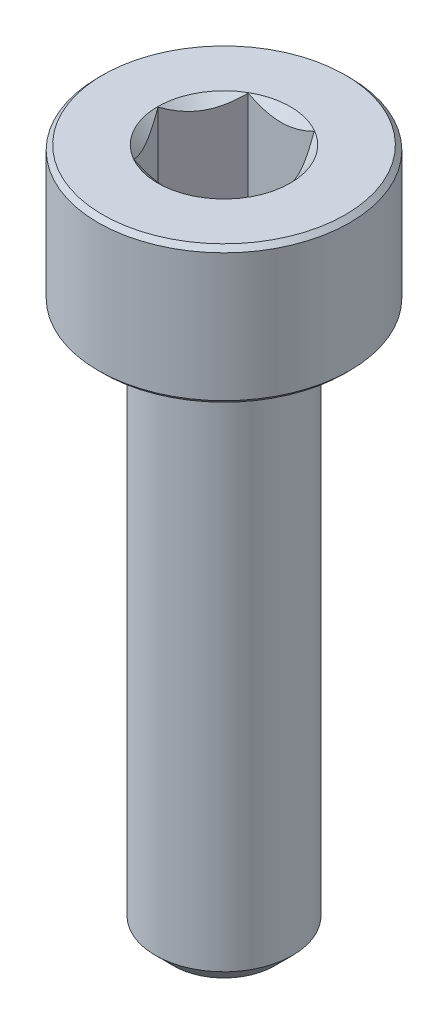
ISO-10303-21;
HEADER;
FILE_DESCRIPTION(('STEP AP214'),'2;1');
FILE_NAME('part.step','',(''),(''),'','','');
FILE_SCHEMA(('AUTOMOTIVE_DESIGN { 1 0 10303 214 1 1 1 1 }'));
ENDSEC;
DATA;
#1=APPLICATION_CONTEXT('core data for automotive mechanical design processes');
#2=APPLICATION_PROTOCOL_DEFINITION('international standard','automotive_design',2000,#1);
#3=PRODUCT_CONTEXT('',#1,'mechanical');
#4=PRODUCT('Part','Part','',(#3));
#5=PRODUCT_RELATED_PRODUCT_CATEGORY('part','',(#4));
#6=PRODUCT_DEFINITION_FORMATION('','',#4);
#7=PRODUCT_DEFINITION_CONTEXT('part definition',#1,'design');
#8=PRODUCT_DEFINITION('design','',#6,#7);
#9=PRODUCT_DEFINITION_SHAPE('','',#8);
#10=(LENGTH_UNIT() NAMED_UNIT(*) SI_UNIT(.MILLI.,.METRE.));
#11=(NAMED_UNIT(*) PLANE_ANGLE_UNIT() SI_UNIT($,.RADIAN.));
#12=(NAMED_UNIT(*) SI_UNIT($,.STERADIAN.) SOLID_ANGLE_UNIT());
#13=UNCERTAINTY_MEASURE_WITH_UNIT(LENGTH_MEASURE(1.E-05),#10,'distance_accuracy_value','');
#14=(GEOMETRIC_REPRESENTATION_CONTEXT(3) GLOBAL_UNCERTAINTY_ASSIGNED_CONTEXT((#13)) GLOBAL_UNIT_ASSIGNED_CONTEXT((#10,
#11,#12)) REPRESENTATION_CONTEXT('',''));
#15=CARTESIAN_POINT('',(0.,0.,0.));
#16=DIRECTION('',(0.,0.,1.));
#17=DIRECTION('',(1.,0.,0.));
#18=AXIS2_PLACEMENT_3D('',#15,#16,#17);
#19=CARTESIAN_POINT('',(146.,110.949080372125,-93.5));
#20=DIRECTION('',(0.,1.,0.));
#21=DIRECTION('',(1.,0.,0.));
#22=AXIS2_PLACEMENT_3D('',#19,#20,#21);
#23=CONICAL_SURFACE('',#22,2.74747334692552,1.22173);
#24=CARTESIAN_POINT('',(146.721687836486,110.474426932663,-92.2499999999985));
#25=CARTESIAN_POINT('',(147.082531754731,110.343090292528,-92.8749999999992));
#26=CARTESIAN_POINT('',(147.443375672974,110.474426932662,-93.4999999999994));
#27=(BOUNDED_CURVE() B_SPLINE_CURVE(2,(#24,#25,#26),.UNSPECIFIED.,.F.,
.F.) B_SPLINE_CURVE_WITH_KNOTS((3,3),(0.,1.),
.UNSPECIFIED.) CURVE() GEOMETRIC_REPRESENTATION_ITEM() RATIONAL_B_SPLINE_CURVE((1.,
1.15470053837961,1.)) REPRESENTATION_ITEM(''));
#28=CARTESIAN_POINT('',(146.721687836487,110.474426932662,-92.25));
#29=VERTEX_POINT('',#28);
#30=CARTESIAN_POINT('',(147.443375672974,110.474426932662,-93.5));
#31=VERTEX_POINT('',#30);
#32=EDGE_CURVE('E10',#29,#31,#27,.T.);
#33=ORIENTED_EDGE('',*,*,#32,.T.);
#34=CARTESIAN_POINT('',(147.443375672975,110.474426932662,-93.4999999999993));
#35=CARTESIAN_POINT('',(147.082531754731,110.343090292528,-94.1249999999996));
#36=CARTESIAN_POINT('',(146.721687836487,110.474426932662,-94.7499999999997));
#37=(BOUNDED_CURVE() B_SPLINE_CURVE(2,(#34,#35,#36),.UNSPECIFIED.,.F.,
.F.) B_SPLINE_CURVE_WITH_KNOTS((3,3),(0.,1.),
.UNSPECIFIED.) CURVE() GEOMETRIC_REPRESENTATION_ITEM() RATIONAL_B_SPLINE_CURVE((1.,
1.15470053837948,1.)) REPRESENTATION_ITEM(''));
#38=CARTESIAN_POINT('',(146.721687836487,110.474426932662,-94.75));
#39=VERTEX_POINT('',#38);
#40=EDGE_CURVE('E96',#31,#39,#37,.T.);
#41=ORIENTED_EDGE('',*,*,#40,.T.);
#42=CARTESIAN_POINT('',(146.721687836488,110.474426932662,-94.75));
#43=CARTESIAN_POINT('',(146.000000000001,110.343090292528,-94.75));
#44=CARTESIAN_POINT('',(145.278312163513,110.474426932662,-94.75));
#45=(BOUNDED_CURVE() B_SPLINE_CURVE(2,(#42,#43,#44),.UNSPECIFIED.,.F.,
.F.) B_SPLINE_CURVE_WITH_KNOTS((3,3),(0.,1.),
.UNSPECIFIED.) CURVE() GEOMETRIC_REPRESENTATION_ITEM() RATIONAL_B_SPLINE_CURVE((1.,
1.15470053837939,1.)) REPRESENTATION_ITEM(''));
#46=CARTESIAN_POINT('',(145.278312163513,110.474426932662,-94.75));
#47=VERTEX_POINT('',#46);
#48=EDGE_CURVE('E169',#39,#47,#45,.T.);
#49=ORIENTED_EDGE('',*,*,#48,.T.);
#50=CARTESIAN_POINT('',(145.278312163514,110.474426932663,-94.7500000000015));
#51=CARTESIAN_POINT('',(144.917468245269,110.343090292528,-94.1250000000008));
#52=CARTESIAN_POINT('',(144.556624327026,110.474426932662,-93.5000000000006));
#53=(BOUNDED_CURVE() B_SPLINE_CURVE(2,(#50,#51,#52),.UNSPECIFIED.,.F.,
.F.) B_SPLINE_CURVE_WITH_KNOTS((3,3),(0.,1.),
.UNSPECIFIED.) CURVE() GEOMETRIC_REPRESENTATION_ITEM() RATIONAL_B_SPLINE_CURVE((1.,
1.15470053837961,1.)) REPRESENTATION_ITEM(''));
#54=CARTESIAN_POINT('',(144.556624327026,110.474426932662,-93.5));
#55=VERTEX_POINT('',#54);
#56=EDGE_CURVE('E139',#47,#55,#53,.T.);
#57=ORIENTED_EDGE('',*,*,#56,.T.);
#58=CARTESIAN_POINT('',(144.556624327025,110.474426932662,-93.5000000000007));
#59=CARTESIAN_POINT('',(144.917468245269,110.343090292528,-92.8750000000004));
#60=CARTESIAN_POINT('',(145.278312163513,110.474426932662,-92.2500000000003));
#61=(BOUNDED_CURVE() B_SPLINE_CURVE(2,(#58,#59,#60),.UNSPECIFIED.,.F.,
.F.) B_SPLINE_CURVE_WITH_KNOTS((3,3),(0.,1.),
.UNSPECIFIED.) CURVE() GEOMETRIC_REPRESENTATION_ITEM() RATIONAL_B_SPLINE_CURVE((1.,
1.15470053837948,1.)) REPRESENTATION_ITEM(''));
#62=CARTESIAN_POINT('',(145.278312163513,110.474426932662,-92.25));
#63=VERTEX_POINT('',#62);
#64=EDGE_CURVE('E217',#55,#63,#61,.T.);
#65=ORIENTED_EDGE('',*,*,#64,.T.);
#66=CARTESIAN_POINT('',(145.278312163512,110.474426932662,-92.25));
#67=CARTESIAN_POINT('',(145.999999999999,110.343090292528,-92.25));
#68=CARTESIAN_POINT('',(146.721687836487,110.474426932662,-92.25));
#69=(BOUNDED_CURVE() B_SPLINE_CURVE(2,(#66,#67,#68),.UNSPECIFIED.,.F.,
.F.) B_SPLINE_CURVE_WITH_KNOTS((3,3),(0.,1.),
.UNSPECIFIED.) CURVE() GEOMETRIC_REPRESENTATION_ITEM() RATIONAL_B_SPLINE_CURVE((1.,
1.15470053837939,1.)) REPRESENTATION_ITEM(''));
#70=EDGE_CURVE('E27',#63,#29,#69,.T.);
#71=ORIENTED_EDGE('',*,*,#70,.T.);
#72=EDGE_LOOP('',(#33,#41,#49,#57,#65,#71));
#73=FACE_BOUND('',#72,.T.);
#74=CARTESIAN_POINT('',(146.,109.949080372125,-93.5));
#75=VERTEX_POINT('',#74);
#76=VERTEX_LOOP('',#75);
#77=FACE_BOUND('',#76,.T.);
#78=ADVANCED_FACE('F16',(#73,#77),#23,.F.);
#79=CARTESIAN_POINT('',(147.443375672974,119.65,-93.5));
#80=DIRECTION('',(-0.866025403784329,0.,-0.50000000000019));
#81=DIRECTION('',(0.,1.,0.));
#82=AXIS2_PLACEMENT_3D('',#79,#80,#81);
#83=PLANE('',#82);
#84=CARTESIAN_POINT('',(146.721687836488,112.643375666478,-92.2500000000014));
#85=CARTESIAN_POINT('',(147.082531754731,112.282531394471,-92.8750000000006));
#86=CARTESIAN_POINT('',(147.443375672975,112.643375666479,-93.5000000000003));
#87=(BOUNDED_CURVE() B_SPLINE_CURVE(2,(#84,#85,#86),.UNSPECIFIED.,.F.,
.F.) B_SPLINE_CURVE_WITH_KNOTS((3,3),(0.,1.),
.UNSPECIFIED.) CURVE() GEOMETRIC_REPRESENTATION_ITEM() RATIONAL_B_SPLINE_CURVE((1.,
1.15470053837916,1.)) REPRESENTATION_ITEM(''));
#88=CARTESIAN_POINT('',(146.721687836487,112.64337566648,-92.25));
#89=VERTEX_POINT('',#88);
#90=CARTESIAN_POINT('',(147.443375672974,112.64337566648,-93.5));
#91=VERTEX_POINT('',#90);
#92=EDGE_CURVE('E101',#89,#91,#87,.T.);
#93=ORIENTED_EDGE('',*,*,#92,.T.);
#94=DIRECTION('',(0.,-1.,0.));
#95=VECTOR('',#94,1.);
#96=CARTESIAN_POINT('',(147.443375672974,119.65,-93.5));
#97=LINE('',#96,#95);
#98=EDGE_CURVE('E89',#91,#31,#97,.T.);
#99=ORIENTED_EDGE('',*,*,#98,.T.);
#100=ORIENTED_EDGE('',*,*,#32,.F.);
#101=DIRECTION('',(0.,-1.,0.));
#102=VECTOR('',#101,1.);
#103=CARTESIAN_POINT('',(146.721687836487,119.65,-92.25));
#104=LINE('',#103,#102);
#105=EDGE_CURVE('E104',#89,#29,#104,.T.);
#106=ORIENTED_EDGE('',*,*,#105,.F.);
#107=EDGE_LOOP('',(#93,#99,#100,#106));
#108=FACE_BOUND('',#107,.T.);
#109=ADVANCED_FACE('F102',(#108),#83,.T.);
#110=CARTESIAN_POINT('',(146.721687836487,119.65,-92.25));
#111=DIRECTION('',(0.,0.,-1.));
#112=DIRECTION('',(0.,-1.,0.));
#113=AXIS2_PLACEMENT_3D('',#110,#111,#112);
#114=PLANE('',#113);
#115=CARTESIAN_POINT('',(145.278312163513,112.64337566648,-92.25));
#116=CARTESIAN_POINT('',(146.,112.282531394472,-92.25));
#117=CARTESIAN_POINT('',(146.721687836487,112.64337566648,-92.25));
#118=(BOUNDED_CURVE() B_SPLINE_CURVE(2,(#115,#116,#117),.UNSPECIFIED.,.F.,
.F.) B_SPLINE_CURVE_WITH_KNOTS((3,3),(0.,1.),
.UNSPECIFIED.) CURVE() GEOMETRIC_REPRESENTATION_ITEM() RATIONAL_B_SPLINE_CURVE((1.,
1.15470053837924,1.)) REPRESENTATION_ITEM(''));
#119=CARTESIAN_POINT('',(145.278312163513,112.64337566648,-92.25));
#120=VERTEX_POINT('',#119);
#121=EDGE_CURVE('E109',#120,#89,#118,.T.);
#122=ORIENTED_EDGE('',*,*,#121,.T.);
#123=ORIENTED_EDGE('',*,*,#105,.T.);
#124=ORIENTED_EDGE('',*,*,#70,.F.);
#125=DIRECTION('',(0.,-1.,0.));
#126=VECTOR('',#125,1.);
#127=CARTESIAN_POINT('',(145.278312163513,119.65,-92.25));
#128=LINE('',#127,#126);
#129=EDGE_CURVE('E145',#120,#63,#128,.T.);
#130=ORIENTED_EDGE('',*,*,#129,.F.);
#131=EDGE_LOOP('',(#122,#123,#124,#130));
#132=FACE_BOUND('',#131,.T.);
#133=ADVANCED_FACE('F277',(#132),#114,.T.);
#134=CARTESIAN_POINT('',(145.278312163513,119.65,-92.25));
#135=DIRECTION('',(0.866025403784329,0.,-0.50000000000019));
#136=DIRECTION('',(0.,-1.,0.));
#137=AXIS2_PLACEMENT_3D('',#134,#135,#136);
#138=PLANE('',#137);
#139=CARTESIAN_POINT('',(144.556624327027,112.643375666478,-93.4999999999977));
#140=CARTESIAN_POINT('',(144.91746824527,112.282531394471,-92.8749999999989));
#141=CARTESIAN_POINT('',(145.278312163513,112.643375666479,-92.2499999999994));
#142=(BOUNDED_CURVE() B_SPLINE_CURVE(2,(#139,#140,#141),.UNSPECIFIED.,.F.,
.F.) B_SPLINE_CURVE_WITH_KNOTS((3,3),(0.,1.),
.UNSPECIFIED.) CURVE() GEOMETRIC_REPRESENTATION_ITEM() RATIONAL_B_SPLINE_CURVE((1.,
1.15470053837903,1.)) REPRESENTATION_ITEM(''));
#143=CARTESIAN_POINT('',(144.556624327026,112.64337566648,-93.5));
#144=VERTEX_POINT('',#143);
#145=EDGE_CURVE('E162',#144,#120,#142,.T.);
#146=ORIENTED_EDGE('',*,*,#145,.T.);
#147=ORIENTED_EDGE('',*,*,#129,.T.);
#148=ORIENTED_EDGE('',*,*,#64,.F.);
#149=DIRECTION('',(0.,-1.,0.));
#150=VECTOR('',#149,1.);
#151=CARTESIAN_POINT('',(144.556624327026,119.65,-93.5));
#152=LINE('',#151,#150);
#153=EDGE_CURVE('E146',#144,#55,#152,.T.);
#154=ORIENTED_EDGE('',*,*,#153,.F.);
#155=EDGE_LOOP('',(#146,#147,#148,#154));
#156=FACE_BOUND('',#155,.T.);
#157=ADVANCED_FACE('F301',(#156),#138,.T.);
#158=CARTESIAN_POINT('',(144.556624327026,119.65,-93.5));
#159=DIRECTION('',(0.866025403784329,0.,0.50000000000019));
#160=DIRECTION('',(0.,-1.,0.));
#161=AXIS2_PLACEMENT_3D('',#158,#159,#160);
#162=PLANE('',#161);
#163=CARTESIAN_POINT('',(145.278312163512,112.643375666478,-94.7499999999986));
#164=CARTESIAN_POINT('',(144.917468245269,112.282531394471,-94.1249999999993));
#165=CARTESIAN_POINT('',(144.556624327025,112.643375666479,-93.4999999999997));
#166=(BOUNDED_CURVE() B_SPLINE_CURVE(2,(#163,#164,#165),.UNSPECIFIED.,.F.,
.F.) B_SPLINE_CURVE_WITH_KNOTS((3,3),(0.,1.),
.UNSPECIFIED.) CURVE() GEOMETRIC_REPRESENTATION_ITEM() RATIONAL_B_SPLINE_CURVE((1.,
1.15470053837916,1.)) REPRESENTATION_ITEM(''));
#167=CARTESIAN_POINT('',(145.278312163513,112.64337566648,-94.75));
#168=VERTEX_POINT('',#167);
#169=EDGE_CURVE('E175',#168,#144,#166,.T.);
#170=ORIENTED_EDGE('',*,*,#169,.T.);
#171=ORIENTED_EDGE('',*,*,#153,.T.);
#172=ORIENTED_EDGE('',*,*,#56,.F.);
#173=DIRECTION('',(0.,-1.,0.));
#174=VECTOR('',#173,1.);
#175=CARTESIAN_POINT('',(145.278312163513,119.65,-94.75));
#176=LINE('',#175,#174);
#177=EDGE_CURVE('E98',#168,#47,#176,.T.);
#178=ORIENTED_EDGE('',*,*,#177,.F.);
#179=EDGE_LOOP('',(#170,#171,#172,#178));
#180=FACE_BOUND('',#179,.T.);
#181=ADVANCED_FACE('F18',(#180),#162,.T.);
#182=CARTESIAN_POINT('',(145.278312163513,119.65,-94.75));
#183=DIRECTION('',(0.,0.,1.));
#184=DIRECTION('',(-1.,0.,0.));
#185=AXIS2_PLACEMENT_3D('',#182,#183,#184);
#186=PLANE('',#185);
#187=CARTESIAN_POINT('',(146.721687836487,112.64337566648,-94.75));
#188=CARTESIAN_POINT('',(146.,112.282531394472,-94.75));
#189=CARTESIAN_POINT('',(145.278312163513,112.64337566648,-94.75));
#190=(BOUNDED_CURVE() B_SPLINE_CURVE(2,(#187,#188,#189),.UNSPECIFIED.,.F.,
.F.) B_SPLINE_CURVE_WITH_KNOTS((3,3),(0.,1.),
.UNSPECIFIED.) CURVE() GEOMETRIC_REPRESENTATION_ITEM() RATIONAL_B_SPLINE_CURVE((1.,
1.15470053837924,1.)) REPRESENTATION_ITEM(''));
#191=CARTESIAN_POINT('',(146.721687836487,112.64337566648,-94.75));
#192=VERTEX_POINT('',#191);
#193=EDGE_CURVE('E115',#192,#168,#190,.T.);
#194=ORIENTED_EDGE('',*,*,#193,.T.);
#195=ORIENTED_EDGE('',*,*,#177,.T.);
#196=ORIENTED_EDGE('',*,*,#48,.F.);
#197=DIRECTION('',(0.,-1.,0.));
#198=VECTOR('',#197,1.);
#199=CARTESIAN_POINT('',(146.721687836487,119.65,-94.75));
#200=LINE('',#199,#198);
#201=EDGE_CURVE('E191',#192,#39,#200,.T.);
#202=ORIENTED_EDGE('',*,*,#201,.F.);
#203=EDGE_LOOP('',(#194,#195,#196,#202));
#204=FACE_BOUND('',#203,.T.);
#205=ADVANCED_FACE('F290',(#204),#186,.T.);
#206=CARTESIAN_POINT('',(146.721687836487,119.65,-94.75));
#207=DIRECTION('',(-0.866025403784329,0.,0.50000000000019));
#208=DIRECTION('',(-0.50000000000019,0.,-0.866025403784329));
#209=AXIS2_PLACEMENT_3D('',#206,#207,#208);
#210=PLANE('',#209);
#211=CARTESIAN_POINT('',(147.443375672973,112.643375666478,-93.5000000000023));
#212=CARTESIAN_POINT('',(147.08253175473,112.282531394471,-94.1250000000011));
#213=CARTESIAN_POINT('',(146.721687836487,112.643375666479,-94.7500000000006));
#214=(BOUNDED_CURVE() B_SPLINE_CURVE(2,(#211,#212,#213),.UNSPECIFIED.,.F.,
.F.) B_SPLINE_CURVE_WITH_KNOTS((3,3),(0.,1.),
.UNSPECIFIED.) CURVE() GEOMETRIC_REPRESENTATION_ITEM() RATIONAL_B_SPLINE_CURVE((1.,
1.15470053837903,1.)) REPRESENTATION_ITEM(''));
#215=EDGE_CURVE('E94',#91,#192,#214,.T.);
#216=ORIENTED_EDGE('',*,*,#215,.T.);
#217=ORIENTED_EDGE('',*,*,#201,.T.);
#218=ORIENTED_EDGE('',*,*,#40,.F.);
#219=ORIENTED_EDGE('',*,*,#98,.F.);
#220=EDGE_LOOP('',(#216,#217,#218,#219));
#221=FACE_BOUND('',#220,.T.);
#222=ADVANCED_FACE('F91',(#221),#210,.T.);
#223=CARTESIAN_POINT('',(146.,112.199998578447,-93.5));
#224=DIRECTION('',(0.,1.,0.));
#225=DIRECTION('',(1.,0.,0.));
#226=AXIS2_PLACEMENT_3D('',#223,#224,#225);
#227=CONICAL_SURFACE('',#226,0.999999019619584,0.785397673207);
#228=CARTESIAN_POINT('',(146.,112.65,-93.5));
#229=DIRECTION('',(0.,-1.,0.));
#230=DIRECTION('',(1.,0.,0.));
#231=AXIS2_PLACEMENT_3D('',#228,#229,#230);
#232=CIRCLE('',#231,1.45);
#233=CARTESIAN_POINT('',(147.45,112.65,-93.5));
#234=VERTEX_POINT('',#233);
#235=EDGE_CURVE('E117',#234,#234,#232,.T.);
#236=ORIENTED_EDGE('',*,*,#235,.F.);
#237=EDGE_LOOP('',(#236));
#238=FACE_BOUND('',#237,.T.);
#239=ORIENTED_EDGE('',*,*,#215,.F.);
#240=ORIENTED_EDGE('',*,*,#92,.F.);
#241=ORIENTED_EDGE('',*,*,#121,.F.);
#242=ORIENTED_EDGE('',*,*,#145,.F.);
#243=ORIENTED_EDGE('',*,*,#169,.F.);
#244=ORIENTED_EDGE('',*,*,#193,.F.);
#245=EDGE_LOOP('',(#239,#240,#241,#242,#243,#244));
#246=FACE_BOUND('',#245,.T.);
#247=ADVANCED_FACE('F112',(#238,#246),#227,.F.);
#248=CARTESIAN_POINT('',(146.,112.65,-93.5));
#249=DIRECTION('',(0.,-1.,0.));
#250=DIRECTION('',(0.,0.,1.));
#251=AXIS2_PLACEMENT_3D('',#248,#249,#250);
#252=PLANE('',#251);
#253=ORIENTED_EDGE('',*,*,#235,.T.);
#254=EDGE_LOOP('',(#253));
#255=FACE_BOUND('',#254,.T.);
#256=CARTESIAN_POINT('',(146.,112.65,-93.5));
#257=DIRECTION('',(0.,-1.,0.));
#258=DIRECTION('',(1.,0.,0.));
#259=AXIS2_PLACEMENT_3D('',#256,#257,#258);
#260=CIRCLE('',#259,2.65);
#261=CARTESIAN_POINT('',(148.65,112.65,-93.5));
#262=VERTEX_POINT('',#261);
#263=EDGE_CURVE('E124',#262,#262,#260,.T.);
#264=ORIENTED_EDGE('',*,*,#263,.F.);
#265=EDGE_LOOP('',(#264));
#266=FACE_BOUND('',#265,.T.);
#267=ADVANCED_FACE('F284',(#255,#266),#252,.F.);
#268=CARTESIAN_POINT('',(146.,97.65,-93.5));
#269=DIRECTION('',(0.,-1.,0.));
#270=DIRECTION('',(0.,0.,1.));
#271=AXIS2_PLACEMENT_3D('',#268,#269,#270);
#272=PLANE('',#271);
#273=CARTESIAN_POINT('',(146.,97.65,-93.5));
#274=DIRECTION('',(0.,-1.,0.));
#275=DIRECTION('',(1.,0.,0.));
#276=AXIS2_PLACEMENT_3D('',#273,#274,#275);
#277=CIRCLE('',#276,1.1);
#278=CARTESIAN_POINT('',(147.1,97.65,-93.5));
#279=VERTEX_POINT('',#278);
#280=EDGE_CURVE('E137',#279,#279,#277,.T.);
#281=ORIENTED_EDGE('',*,*,#280,.T.);
#282=EDGE_LOOP('',(#281));
#283=FACE_BOUND('',#282,.T.);
#284=ADVANCED_FACE('F280',(#283),#272,.T.);
#285=CARTESIAN_POINT('',(146.,112.55,-93.5));
#286=DIRECTION('',(0.,-1.,0.));
#287=DIRECTION('',(1.,0.,0.));
#288=AXIS2_PLACEMENT_3D('',#285,#286,#287);
#289=CONICAL_SURFACE('',#288,2.75,0.785398163397);
#290=ORIENTED_EDGE('',*,*,#263,.T.);
#291=EDGE_LOOP('',(#290));
#292=FACE_BOUND('',#291,.T.);
#293=CARTESIAN_POINT('',(146.,112.55,-93.5));
#294=DIRECTION('',(0.,-1.,0.));
#295=DIRECTION('',(1.,0.,0.));
#296=AXIS2_PLACEMENT_3D('',#293,#294,#295);
#297=CIRCLE('',#296,2.75);
#298=CARTESIAN_POINT('',(148.75,112.55,-93.5));
#299=VERTEX_POINT('',#298);
#300=EDGE_CURVE('E132',#299,#299,#297,.T.);
#301=ORIENTED_EDGE('',*,*,#300,.F.);
#302=EDGE_LOOP('',(#301));
#303=FACE_BOUND('',#302,.T.);
#304=ADVANCED_FACE('F283',(#292,#303),#289,.T.);
#305=CARTESIAN_POINT('',(146.,98.05,-93.5));
#306=DIRECTION('',(0.,1.,0.));
#307=DIRECTION('',(1.,0.,0.));
#308=AXIS2_PLACEMENT_3D('',#305,#306,#307);
#309=CONICAL_SURFACE('',#308,1.5,0.785398163397);
#310=ORIENTED_EDGE('',*,*,#280,.F.);
#311=EDGE_LOOP('',(#310));
#312=FACE_BOUND('',#311,.T.);
#313=CARTESIAN_POINT('',(146.,98.05,-93.5));
#314=DIRECTION('',(0.,-1.,0.));
#315=DIRECTION('',(1.,0.,0.));
#316=AXIS2_PLACEMENT_3D('',#313,#314,#315);
#317=CIRCLE('',#316,1.5);
#318=CARTESIAN_POINT('',(147.5,98.05,-93.5));
#319=VERTEX_POINT('',#318);
#320=EDGE_CURVE('E130',#319,#319,#317,.T.);
#321=ORIENTED_EDGE('',*,*,#320,.T.);
#322=EDGE_LOOP('',(#321));
#323=FACE_BOUND('',#322,.T.);
#324=ADVANCED_FACE('F288',(#312,#323),#309,.T.);
#325=CARTESIAN_POINT('',(146.,112.65,-93.5));
#326=DIRECTION('',(0.,-1.,0.));
#327=DIRECTION('',(1.,0.,0.));
#328=AXIS2_PLACEMENT_3D('',#325,#326,#327);
#329=CYLINDRICAL_SURFACE('',#328,2.75);
#330=CARTESIAN_POINT('',(146.,109.75,-93.5));
#331=DIRECTION('',(0.,-1.,0.));
#332=DIRECTION('',(1.,0.,0.));
#333=AXIS2_PLACEMENT_3D('',#330,#331,#332);
#334=CIRCLE('',#333,2.75);
#335=CARTESIAN_POINT('',(148.75,109.75,-93.5));
#336=VERTEX_POINT('',#335);
#337=EDGE_CURVE('E245',#336,#336,#334,.T.);
#338=ORIENTED_EDGE('',*,*,#337,.F.);
#339=EDGE_LOOP('',(#338));
#340=FACE_BOUND('',#339,.T.);
#341=ORIENTED_EDGE('',*,*,#300,.T.);
#342=EDGE_LOOP('',(#341));
#343=FACE_BOUND('',#342,.T.);
#344=ADVANCED_FACE('F269',(#340,#343),#329,.T.);
#345=CARTESIAN_POINT('',(146.,109.65,-93.5));
#346=DIRECTION('',(0.,-1.,0.));
#347=DIRECTION('',(1.,0.,0.));
#348=AXIS2_PLACEMENT_3D('',#345,#346,#347);
#349=CYLINDRICAL_SURFACE('',#348,1.5);
#350=ORIENTED_EDGE('',*,*,#320,.F.);
#351=EDGE_LOOP('',(#350));
#352=FACE_BOUND('',#351,.T.);
#353=CARTESIAN_POINT('',(146.,109.65,-93.5));
#354=DIRECTION('',(0.,-1.,0.));
#355=DIRECTION('',(1.,0.,0.));
#356=AXIS2_PLACEMENT_3D('',#353,#354,#355);
#357=CIRCLE('',#356,1.5);
#358=CARTESIAN_POINT('',(147.5,109.65,-93.5));
#359=VERTEX_POINT('',#358);
#360=EDGE_CURVE('E238',#359,#359,#357,.T.);
#361=ORIENTED_EDGE('',*,*,#360,.T.);
#362=EDGE_LOOP('',(#361));
#363=FACE_BOUND('',#362,.T.);
#364=ADVANCED_FACE('F259',(#352,#363),#349,.T.);
#365=CARTESIAN_POINT('',(146.,109.75,-93.5));
#366=DIRECTION('',(0.,1.,0.));
#367=DIRECTION('',(1.,0.,0.));
#368=AXIS2_PLACEMENT_3D('',#365,#366,#367);
#369=CONICAL_SURFACE('',#368,2.75,0.785398163397);
#370=ORIENTED_EDGE('',*,*,#337,.T.);
#371=EDGE_LOOP('',(#370));
#372=FACE_BOUND('',#371,.T.);
#373=CARTESIAN_POINT('',(146.,109.65,-93.5));
#374=DIRECTION('',(0.,-1.,0.));
#375=DIRECTION('',(1.,0.,0.));
#376=AXIS2_PLACEMENT_3D('',#373,#374,#375);
#377=CIRCLE('',#376,2.65);
#378=CARTESIAN_POINT('',(148.65,109.65,-93.5));
#379=VERTEX_POINT('',#378);
#380=EDGE_CURVE('E246',#379,#379,#377,.T.);
#381=ORIENTED_EDGE('',*,*,#380,.F.);
#382=EDGE_LOOP('',(#381));
#383=FACE_BOUND('',#382,.T.);
#384=ADVANCED_FACE('F257',(#372,#383),#369,.T.);
#385=CARTESIAN_POINT('',(146.,109.65,-93.5));
#386=DIRECTION('',(0.,-1.,0.));
#387=DIRECTION('',(0.,0.,1.));
#388=AXIS2_PLACEMENT_3D('',#385,#386,#387);
#389=PLANE('',#388);
#390=ORIENTED_EDGE('',*,*,#360,.F.);
#391=EDGE_LOOP('',(#390));
#392=FACE_BOUND('',#391,.T.);
#393=ORIENTED_EDGE('',*,*,#380,.T.);
#394=EDGE_LOOP('',(#393));
#395=FACE_BOUND('',#394,.T.);
#396=ADVANCED_FACE('F255',(#392,#395),#389,.T.);
#397=CLOSED_SHELL('',(#78,#109,#133,#157,#181,#205,#222,#247,#267,#284,#304,#324,#344,#364,#384,#396));
#398=MANIFOLD_SOLID_BREP('B1',#397);
#399=ADVANCED_BREP_SHAPE_REPRESENTATION('',(#18,#398),#14);
#400=SHAPE_DEFINITION_REPRESENTATION(#9,#399);
ENDSEC;
END-ISO-10303-21;
